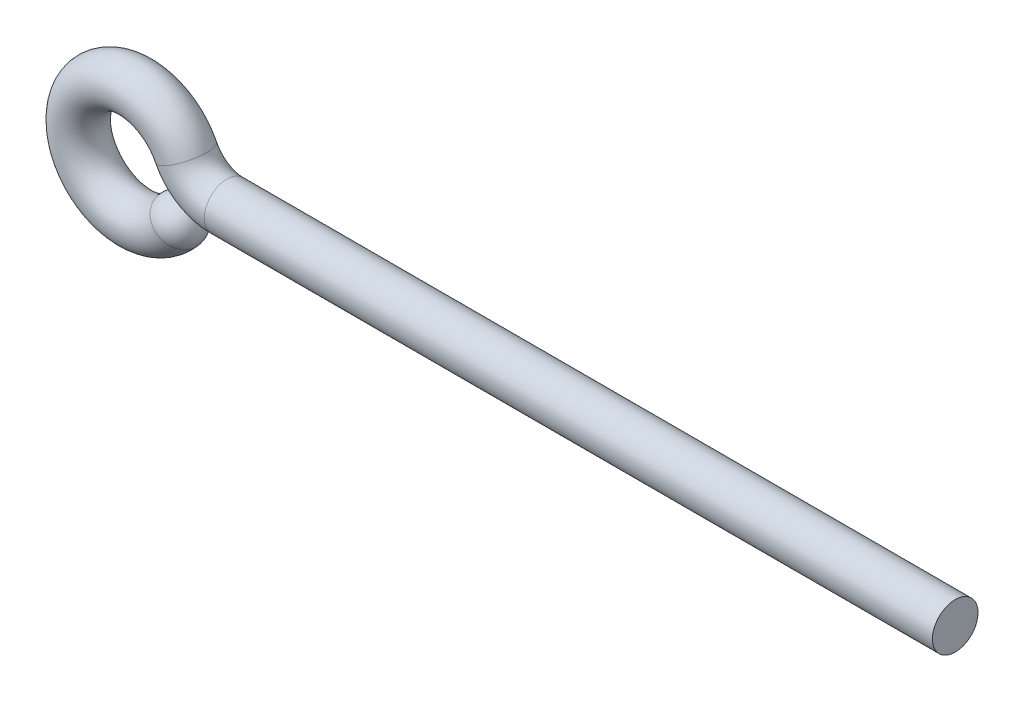
ISO-10303-21;
HEADER;
FILE_DESCRIPTION(('STEP AP214'),'2;1');
FILE_NAME('part.step','',(''),(''),'','','');
FILE_SCHEMA(('AUTOMOTIVE_DESIGN { 1 0 10303 214 1 1 1 1 }'));
ENDSEC;
DATA;
#1=APPLICATION_CONTEXT('core data for automotive mechanical design processes');
#2=APPLICATION_PROTOCOL_DEFINITION('international standard','automotive_design',2000,#1);
#3=PRODUCT_CONTEXT('',#1,'mechanical');
#4=PRODUCT('Part','Part','',(#3));
#5=PRODUCT_RELATED_PRODUCT_CATEGORY('part','',(#4));
#6=PRODUCT_DEFINITION_FORMATION('','',#4);
#7=PRODUCT_DEFINITION_CONTEXT('part definition',#1,'design');
#8=PRODUCT_DEFINITION('design','',#6,#7);
#9=PRODUCT_DEFINITION_SHAPE('','',#8);
#10=(LENGTH_UNIT() NAMED_UNIT(*) SI_UNIT(.MILLI.,.METRE.));
#11=(NAMED_UNIT(*) PLANE_ANGLE_UNIT() SI_UNIT($,.RADIAN.));
#12=(NAMED_UNIT(*) SI_UNIT($,.STERADIAN.) SOLID_ANGLE_UNIT());
#13=UNCERTAINTY_MEASURE_WITH_UNIT(LENGTH_MEASURE(1.E-05),#10,'distance_accuracy_value','');
#14=(GEOMETRIC_REPRESENTATION_CONTEXT(3) GLOBAL_UNCERTAINTY_ASSIGNED_CONTEXT((#13)) GLOBAL_UNIT_ASSIGNED_CONTEXT((#10,
#11,#12)) REPRESENTATION_CONTEXT('',''));
#15=CARTESIAN_POINT('',(0.,0.,0.));
#16=DIRECTION('',(0.,0.,1.));
#17=DIRECTION('',(1.,0.,0.));
#18=AXIS2_PLACEMENT_3D('',#15,#16,#17);
#19=CARTESIAN_POINT('',(-4.08488889220255,-1.60696902421634,0.));
#20=DIRECTION('',(0.,0.,1.));
#21=DIRECTION('',(1.,0.,0.));
#22=AXIS2_PLACEMENT_3D('',#19,#20,#21);
#23=SPHERICAL_SURFACE('',#22,1.);
#24=CARTESIAN_POINT('',(-4.08488889220255,-1.60696902421634,0.));
#25=DIRECTION('',(-0.642787609686535,-0.766044443118982,0.));
#26=DIRECTION('',(0.,0.,-1.));
#27=AXIS2_PLACEMENT_3D('',#24,#25,#26);
#28=SPHERICAL_SURFACE('',#27,1.);
#29=CARTESIAN_POINT('',(-4.08488889220255,-1.60696902421634,0.));
#30=DIRECTION('',(-0.642787609686535,-0.766044443118982,0.));
#31=DIRECTION('',(0.,0.,-1.));
#32=AXIS2_PLACEMENT_3D('',#29,#30,#31);
#33=CIRCLE('',#32,1.);
#34=CARTESIAN_POINT('',(-4.08488889220255,-1.60696902421634,-1.));
#35=VERTEX_POINT('',#34);
#36=EDGE_CURVE('E10',#35,#35,#33,.T.);
#37=ORIENTED_EDGE('',*,*,#36,.F.);
#38=EDGE_LOOP('',(#37));
#39=FACE_BOUND('',#38,.T.);
#40=ADVANCED_FACE('F44',(#39),#28,.T.);
#41=CARTESIAN_POINT('',(0.,0.,0.));
#42=DIRECTION('',(-1.,0.,0.));
#43=DIRECTION('',(0.,0.,1.));
#44=AXIS2_PLACEMENT_3D('',#41,#42,#43);
#45=CYLINDRICAL_SURFACE('',#44,1.);
#46=CARTESIAN_POINT('',(-1.96887112585072,0.,0.));
#47=DIRECTION('',(1.,0.,0.));
#48=DIRECTION('',(0.,0.,-1.));
#49=AXIS2_PLACEMENT_3D('',#46,#47,#48);
#50=CIRCLE('',#49,1.);
#51=CARTESIAN_POINT('',(-1.96887112585072,-1.,0.));
#52=VERTEX_POINT('',#51);
#53=EDGE_CURVE('E54',#52,#52,#50,.T.);
#54=ORIENTED_EDGE('',*,*,#53,.T.);
#55=EDGE_LOOP('',(#54));
#56=FACE_BOUND('',#55,.T.);
#57=CARTESIAN_POINT('',(30.,0.,0.));
#58=DIRECTION('',(1.,0.,0.));
#59=DIRECTION('',(0.,0.,-1.));
#60=AXIS2_PLACEMENT_3D('',#57,#58,#59);
#61=CIRCLE('',#60,1.);
#62=CARTESIAN_POINT('',(30.,0.,-1.));
#63=VERTEX_POINT('',#62);
#64=EDGE_CURVE('E58',#63,#63,#61,.T.);
#65=ORIENTED_EDGE('',*,*,#64,.F.);
#66=EDGE_LOOP('',(#65));
#67=FACE_BOUND('',#66,.T.);
#68=ADVANCED_FACE('F66',(#56,#67),#45,.T.);
#69=CARTESIAN_POINT('',(-1.96887112585072,2.,0.));
#70=DIRECTION('',(0.,0.,-1.));
#71=DIRECTION('',(-1.,0.,0.));
#72=AXIS2_PLACEMENT_3D('',#69,#70,#71);
#73=TOROIDAL_SURFACE('',#72,2.,1.);
#74=CARTESIAN_POINT('',(-3.76048395880596,1.11111111111111,0.));
#75=DIRECTION('',(0.444444444444444,-0.895806416477617,0.));
#76=DIRECTION('',(0.,0.,-1.));
#77=AXIS2_PLACEMENT_3D('',#74,#75,#76);
#78=CIRCLE('',#77,1.);
#79=CARTESIAN_POINT('',(-4.65629037528358,0.666666666666667,0.));
#80=VERTEX_POINT('',#79);
#81=EDGE_CURVE('E50',#80,#80,#78,.T.);
#82=CARTESIAN_POINT('',(-1.96887112585072,2.,0.));
#83=DIRECTION('',(0.,0.,-1.));
#84=DIRECTION('',(-1.,0.,0.));
#85=AXIS2_PLACEMENT_3D('',#82,#83,#84);
#86=CIRCLE('',#85,3.);
#87=EDGE_CURVE('',#52,#80,#86,.T.);
#88=ORIENTED_EDGE('',*,*,#53,.F.);
#89=ORIENTED_EDGE('',*,*,#81,.T.);
#90=ORIENTED_EDGE('',*,*,#87,.T.);
#91=ORIENTED_EDGE('',*,*,#87,.F.);
#92=EDGE_LOOP('',(#88,#90,#89,#91));
#93=FACE_BOUND('',#92,.T.);
#94=ADVANCED_FACE('F68',(#93),#73,.T.);
#95=CARTESIAN_POINT('',(-6.,0.,0.));
#96=DIRECTION('',(0.,0.,1.));
#97=DIRECTION('',(1.,0.,0.));
#98=AXIS2_PLACEMENT_3D('',#95,#96,#97);
#99=TOROIDAL_SURFACE('',#98,2.5,1.);
#100=ORIENTED_EDGE('',*,*,#36,.T.);
#101=EDGE_LOOP('',(#100));
#102=FACE_BOUND('',#101,.T.);
#103=ORIENTED_EDGE('',*,*,#81,.F.);
#104=EDGE_LOOP('',(#103));
#105=FACE_BOUND('',#104,.T.);
#106=ADVANCED_FACE('F74',(#102,#105),#99,.T.);
#107=CARTESIAN_POINT('',(30.,0.,0.));
#108=DIRECTION('',(1.,0.,0.));
#109=DIRECTION('',(0.,0.,-1.));
#110=AXIS2_PLACEMENT_3D('',#107,#108,#109);
#111=PLANE('',#110);
#112=ORIENTED_EDGE('',*,*,#64,.T.);
#113=EDGE_LOOP('',(#112));
#114=FACE_BOUND('',#113,.T.);
#115=ADVANCED_FACE('F64',(#114),#111,.T.);
#116=CLOSED_SHELL('',(#40,#68,#94,#106,#115));
#117=MANIFOLD_SOLID_BREP('B2',#116);
#118=ADVANCED_BREP_SHAPE_REPRESENTATION('',(#18,#117),#14);
#119=SHAPE_DEFINITION_REPRESENTATION(#9,#118);
ENDSEC;
END-ISO-10303-21;
